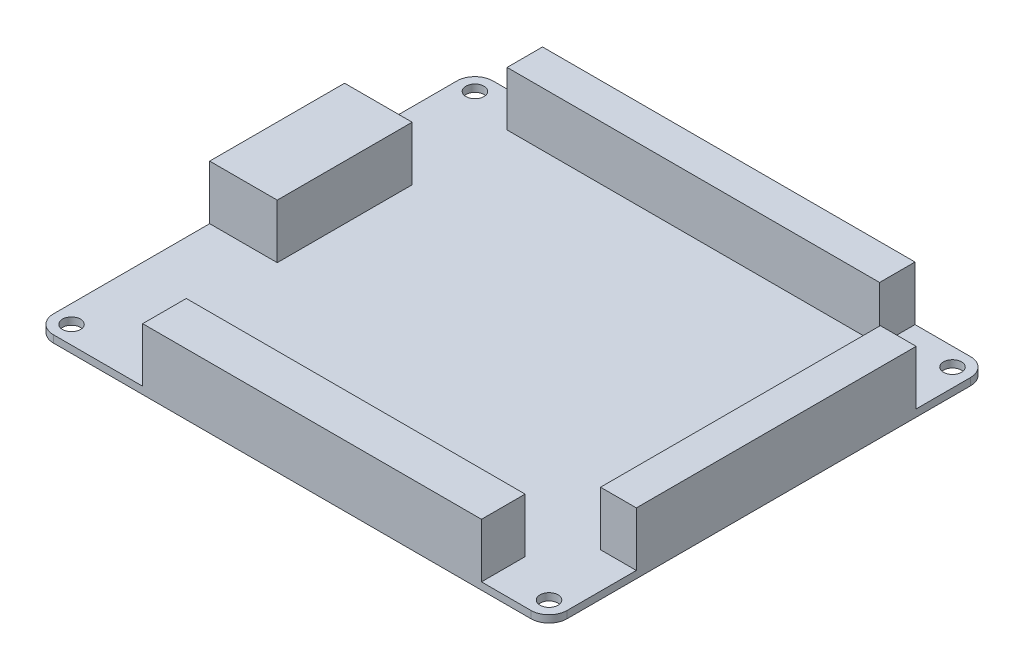
ISO-10303-21;
HEADER;
FILE_DESCRIPTION(('STEP AP214'),'2;1');
FILE_NAME('part.step','',(''),(''),'','','');
FILE_SCHEMA(('AUTOMOTIVE_DESIGN { 1 0 10303 214 1 1 1 1 }'));
ENDSEC;
DATA;
#1=APPLICATION_CONTEXT('core data for automotive mechanical design processes');
#2=APPLICATION_PROTOCOL_DEFINITION('international standard','automotive_design',2000,#1);
#3=PRODUCT_CONTEXT('',#1,'mechanical');
#4=PRODUCT('Part','Part','',(#3));
#5=PRODUCT_RELATED_PRODUCT_CATEGORY('part','',(#4));
#6=PRODUCT_DEFINITION_FORMATION('','',#4);
#7=PRODUCT_DEFINITION_CONTEXT('part definition',#1,'design');
#8=PRODUCT_DEFINITION('design','',#6,#7);
#9=PRODUCT_DEFINITION_SHAPE('','',#8);
#10=(LENGTH_UNIT() NAMED_UNIT(*) SI_UNIT(.MILLI.,.METRE.));
#11=(NAMED_UNIT(*) PLANE_ANGLE_UNIT() SI_UNIT($,.RADIAN.));
#12=(NAMED_UNIT(*) SI_UNIT($,.STERADIAN.) SOLID_ANGLE_UNIT());
#13=UNCERTAINTY_MEASURE_WITH_UNIT(LENGTH_MEASURE(1.E-05),#10,'distance_accuracy_value','');
#14=(GEOMETRIC_REPRESENTATION_CONTEXT(3) GLOBAL_UNCERTAINTY_ASSIGNED_CONTEXT((#13)) GLOBAL_UNIT_ASSIGNED_CONTEXT((#10,
#11,#12)) REPRESENTATION_CONTEXT('',''));
#15=CARTESIAN_POINT('',(0.,0.,0.));
#16=DIRECTION('',(0.,0.,1.));
#17=DIRECTION('',(1.,0.,0.));
#18=AXIS2_PLACEMENT_3D('',#15,#16,#17);
#19=CARTESIAN_POINT('',(0.,1.2,0.));
#20=DIRECTION('',(0.,1.,0.));
#21=DIRECTION('',(0.,0.,1.));
#22=AXIS2_PLACEMENT_3D('',#19,#20,#21);
#23=PLANE('',#22);
#24=CARTESIAN_POINT('',(39.65,1.2,33.5));
#25=DIRECTION('',(0.,1.,0.));
#26=DIRECTION('',(0.,0.,1.));
#27=AXIS2_PLACEMENT_3D('',#24,#25,#26);
#28=CIRCLE('',#27,1.5);
#29=CARTESIAN_POINT('',(39.65,1.2,35.));
#30=VERTEX_POINT('',#29);
#31=EDGE_CURVE('E323',#30,#30,#28,.T.);
#32=ORIENTED_EDGE('',*,*,#31,.F.);
#33=EDGE_LOOP('',(#32));
#34=FACE_BOUND('',#33,.T.);
#35=CARTESIAN_POINT('',(-39.65,1.2,33.5));
#36=DIRECTION('',(0.,1.,0.));
#37=DIRECTION('',(0.,0.,1.));
#38=AXIS2_PLACEMENT_3D('',#35,#36,#37);
#39=CIRCLE('',#38,1.5);
#40=CARTESIAN_POINT('',(-39.65,1.2,35.));
#41=VERTEX_POINT('',#40);
#42=EDGE_CURVE('E326',#41,#41,#39,.T.);
#43=ORIENTED_EDGE('',*,*,#42,.F.);
#44=EDGE_LOOP('',(#43));
#45=FACE_BOUND('',#44,.T.);
#46=CARTESIAN_POINT('',(-39.65,1.2,-33.5));
#47=DIRECTION('',(0.,1.,0.));
#48=DIRECTION('',(0.,0.,1.));
#49=AXIS2_PLACEMENT_3D('',#46,#47,#48);
#50=CIRCLE('',#49,1.5);
#51=CARTESIAN_POINT('',(-39.65,1.2,-32.));
#52=VERTEX_POINT('',#51);
#53=EDGE_CURVE('E330',#52,#52,#50,.T.);
#54=ORIENTED_EDGE('',*,*,#53,.F.);
#55=EDGE_LOOP('',(#54));
#56=FACE_BOUND('',#55,.T.);
#57=CARTESIAN_POINT('',(39.65,1.2,-33.5));
#58=DIRECTION('',(0.,1.,0.));
#59=DIRECTION('',(0.,0.,1.));
#60=AXIS2_PLACEMENT_3D('',#57,#58,#59);
#61=CIRCLE('',#60,1.5);
#62=CARTESIAN_POINT('',(39.65,1.2,-32.));
#63=VERTEX_POINT('',#62);
#64=EDGE_CURVE('E333',#63,#63,#61,.T.);
#65=ORIENTED_EDGE('',*,*,#64,.F.);
#66=EDGE_LOOP('',(#65));
#67=FACE_BOUND('',#66,.T.);
#68=DIRECTION('',(0.,0.,-1.));
#69=VECTOR('',#68,1.);
#70=CARTESIAN_POINT('',(-31.4294914173132,1.2,7.5566174845676));
#71=LINE('',#70,#69);
#72=CARTESIAN_POINT('',(-31.4294914173132,1.2,7.5566174845676));
#73=VERTEX_POINT('',#72);
#74=CARTESIAN_POINT('',(-31.4294914173132,1.2,-14.8489717856251));
#75=VERTEX_POINT('',#74);
#76=EDGE_CURVE('E207',#73,#75,#71,.T.);
#77=ORIENTED_EDGE('',*,*,#76,.F.);
#78=DIRECTION('',(1.,0.,0.));
#79=VECTOR('',#78,1.);
#80=CARTESIAN_POINT('',(-42.65,1.2,7.5566174845676));
#81=LINE('',#80,#79);
#82=CARTESIAN_POINT('',(-42.65,1.2,7.5566174845676));
#83=VERTEX_POINT('',#82);
#84=EDGE_CURVE('E217',#83,#73,#81,.T.);
#85=ORIENTED_EDGE('',*,*,#84,.F.);
#86=DIRECTION('',(0.,0.,-1.));
#87=VECTOR('',#86,1.);
#88=CARTESIAN_POINT('',(-42.65,1.2,0.));
#89=LINE('',#88,#87);
#90=CARTESIAN_POINT('',(-42.65,1.2,33.5));
#91=VERTEX_POINT('',#90);
#92=EDGE_CURVE('E341',#91,#83,#89,.T.);
#93=ORIENTED_EDGE('',*,*,#92,.F.);
#94=CARTESIAN_POINT('',(-39.65,1.2,33.5));
#95=DIRECTION('',(0.,1.,0.));
#96=DIRECTION('',(0.,0.,1.));
#97=AXIS2_PLACEMENT_3D('',#94,#95,#96);
#98=CIRCLE('',#97,3.);
#99=CARTESIAN_POINT('',(-39.65,1.2,36.5));
#100=VERTEX_POINT('',#99);
#101=EDGE_CURVE('E344',#100,#91,#98,.F.);
#102=ORIENTED_EDGE('',*,*,#101,.F.);
#103=DIRECTION('',(-1.,0.,0.));
#104=VECTOR('',#103,1.);
#105=CARTESIAN_POINT('',(0.,1.2,36.5));
#106=LINE('',#105,#104);
#107=CARTESIAN_POINT('',(-24.8332701548577,1.2,36.5));
#108=VERTEX_POINT('',#107);
#109=EDGE_CURVE('E347',#108,#100,#106,.T.);
#110=ORIENTED_EDGE('',*,*,#109,.F.);
#111=DIRECTION('',(0.,0.,1.));
#112=VECTOR('',#111,1.);
#113=CARTESIAN_POINT('',(-24.8332701548577,1.2,36.5));
#114=LINE('',#113,#112);
#115=CARTESIAN_POINT('',(-24.8332701548577,1.2,29.2535338291486));
#116=VERTEX_POINT('',#115);
#117=EDGE_CURVE('E285',#116,#108,#114,.T.);
#118=ORIENTED_EDGE('',*,*,#117,.F.);
#119=DIRECTION('',(-1.,0.,0.));
#120=VECTOR('',#119,1.);
#121=CARTESIAN_POINT('',(-24.8332701548577,1.2,29.2535338291486));
#122=LINE('',#121,#120);
#123=CARTESIAN_POINT('',(31.4318004054144,1.2,29.2535338291486));
#124=VERTEX_POINT('',#123);
#125=EDGE_CURVE('E297',#124,#116,#122,.T.);
#126=ORIENTED_EDGE('',*,*,#125,.F.);
#127=DIRECTION('',(0.,0.,-1.));
#128=VECTOR('',#127,1.);
#129=CARTESIAN_POINT('',(31.4318004054144,1.2,36.5));
#130=LINE('',#129,#128);
#131=CARTESIAN_POINT('',(31.4318004054144,1.2,36.5));
#132=VERTEX_POINT('',#131);
#133=EDGE_CURVE('E306',#132,#124,#130,.T.);
#134=ORIENTED_EDGE('',*,*,#133,.F.);
#135=CARTESIAN_POINT('',(39.65,1.2,36.5));
#136=VERTEX_POINT('',#135);
#137=EDGE_CURVE('E348',#136,#132,#106,.T.);
#138=ORIENTED_EDGE('',*,*,#137,.F.);
#139=CARTESIAN_POINT('',(39.65,1.2,33.5));
#140=DIRECTION('',(0.,1.,0.));
#141=DIRECTION('',(0.,0.,1.));
#142=AXIS2_PLACEMENT_3D('',#139,#140,#141);
#143=CIRCLE('',#142,3.);
#144=CARTESIAN_POINT('',(42.65,1.2,33.5));
#145=VERTEX_POINT('',#144);
#146=EDGE_CURVE('E351',#136,#145,#143,.T.);
#147=ORIENTED_EDGE('',*,*,#146,.T.);
#148=DIRECTION('',(0.,0.,-1.));
#149=VECTOR('',#148,1.);
#150=CARTESIAN_POINT('',(42.65,1.2,0.));
#151=LINE('',#150,#149);
#152=CARTESIAN_POINT('',(42.65,1.2,22.0023264793383));
#153=VERTEX_POINT('',#152);
#154=EDGE_CURVE('E354',#145,#153,#151,.T.);
#155=ORIENTED_EDGE('',*,*,#154,.T.);
#156=DIRECTION('',(1.,0.,0.));
#157=VECTOR('',#156,1.);
#158=CARTESIAN_POINT('',(42.65,1.2,22.0023264793383));
#159=LINE('',#158,#157);
#160=CARTESIAN_POINT('',(36.7030546103138,1.2,22.0023264793383));
#161=VERTEX_POINT('',#160);
#162=EDGE_CURVE('E277',#161,#153,#159,.T.);
#163=ORIENTED_EDGE('',*,*,#162,.F.);
#164=DIRECTION('',(0.,0.,1.));
#165=VECTOR('',#164,1.);
#166=CARTESIAN_POINT('',(36.7030546103138,1.2,22.0023264793383));
#167=LINE('',#166,#165);
#168=CARTESIAN_POINT('',(36.7030546103138,1.2,-24.4645359927915));
#169=VERTEX_POINT('',#168);
#170=EDGE_CURVE('E279',#169,#161,#167,.T.);
#171=ORIENTED_EDGE('',*,*,#170,.F.);
#172=DIRECTION('',(-1.,0.,0.));
#173=VECTOR('',#172,1.);
#174=CARTESIAN_POINT('',(42.65,1.2,-24.4645359927915));
#175=LINE('',#174,#173);
#176=CARTESIAN_POINT('',(42.65,1.2,-24.4645359927915));
#177=VERTEX_POINT('',#176);
#178=EDGE_CURVE('E283',#177,#169,#175,.T.);
#179=ORIENTED_EDGE('',*,*,#178,.F.);
#180=CARTESIAN_POINT('',(42.65,1.2,-33.5));
#181=VERTEX_POINT('',#180);
#182=EDGE_CURVE('E353',#177,#181,#151,.T.);
#183=ORIENTED_EDGE('',*,*,#182,.T.);
#184=CARTESIAN_POINT('',(39.65,1.2,-33.5));
#185=DIRECTION('',(0.,1.,0.));
#186=DIRECTION('',(0.,0.,1.));
#187=AXIS2_PLACEMENT_3D('',#184,#185,#186);
#188=CIRCLE('',#187,3.);
#189=CARTESIAN_POINT('',(39.65,1.2,-36.5));
#190=VERTEX_POINT('',#189);
#191=EDGE_CURVE('E357',#181,#190,#188,.T.);
#192=ORIENTED_EDGE('',*,*,#191,.T.);
#193=DIRECTION('',(-1.,0.,0.));
#194=VECTOR('',#193,1.);
#195=CARTESIAN_POINT('',(0.,1.2,-36.5));
#196=LINE('',#195,#194);
#197=CARTESIAN_POINT('',(30.428301479688,1.2,-36.5));
#198=VERTEX_POINT('',#197);
#199=EDGE_CURVE('E337',#190,#198,#196,.T.);
#200=ORIENTED_EDGE('',*,*,#199,.T.);
#201=DIRECTION('',(0.,0.,-1.));
#202=VECTOR('',#201,1.);
#203=CARTESIAN_POINT('',(30.428301479688,1.2,-36.5));
#204=LINE('',#203,#202);
#205=CARTESIAN_POINT('',(30.428301479688,1.2,-30.6142275398429));
#206=VERTEX_POINT('',#205);
#207=EDGE_CURVE('E256',#206,#198,#204,.T.);
#208=ORIENTED_EDGE('',*,*,#207,.F.);
#209=DIRECTION('',(1.,0.,0.));
#210=VECTOR('',#209,1.);
#211=CARTESIAN_POINT('',(30.428301479688,1.2,-30.6142275398429));
#212=LINE('',#211,#210);
#213=CARTESIAN_POINT('',(-31.4294914173132,1.2,-30.6142275398429));
#214=VERTEX_POINT('',#213);
#215=EDGE_CURVE('E66',#214,#206,#212,.T.);
#216=ORIENTED_EDGE('',*,*,#215,.F.);
#217=DIRECTION('',(0.,0.,1.));
#218=VECTOR('',#217,1.);
#219=CARTESIAN_POINT('',(-31.4294914173132,1.2,-36.5));
#220=LINE('',#219,#218);
#221=CARTESIAN_POINT('',(-31.4294914173132,1.2,-36.5));
#222=VERTEX_POINT('',#221);
#223=EDGE_CURVE('E253',#222,#214,#220,.T.);
#224=ORIENTED_EDGE('',*,*,#223,.F.);
#225=CARTESIAN_POINT('',(-39.65,1.2,-36.5));
#226=VERTEX_POINT('',#225);
#227=EDGE_CURVE('E336',#222,#226,#196,.T.);
#228=ORIENTED_EDGE('',*,*,#227,.T.);
#229=CARTESIAN_POINT('',(-39.65,1.2,-33.5));
#230=DIRECTION('',(0.,1.,0.));
#231=DIRECTION('',(0.,0.,1.));
#232=AXIS2_PLACEMENT_3D('',#229,#230,#231);
#233=CIRCLE('',#232,3.);
#234=CARTESIAN_POINT('',(-42.65,1.2,-33.5));
#235=VERTEX_POINT('',#234);
#236=EDGE_CURVE('E339',#226,#235,#233,.T.);
#237=ORIENTED_EDGE('',*,*,#236,.T.);
#238=CARTESIAN_POINT('',(-42.65,1.2,-14.8489717856251));
#239=VERTEX_POINT('',#238);
#240=EDGE_CURVE('E226',#239,#235,#89,.T.);
#241=ORIENTED_EDGE('',*,*,#240,.F.);
#242=DIRECTION('',(-1.,0.,0.));
#243=VECTOR('',#242,1.);
#244=CARTESIAN_POINT('',(-42.65,1.2,-14.8489717856251));
#245=LINE('',#244,#243);
#246=EDGE_CURVE('E218',#75,#239,#245,.T.);
#247=ORIENTED_EDGE('',*,*,#246,.F.);
#248=EDGE_LOOP('',(#77,#85,#93,#102,#110,#118,#126,#134,#138,#147,#155,#163,#171,#179,#183,#192,
#200,#208,#216,#224,#228,#237,#241,#247));
#249=FACE_BOUND('',#248,.T.);
#250=ADVANCED_FACE('F43',(#34,#45,#56,#67,#249),#23,.T.);
#251=CARTESIAN_POINT('',(0.,1.2,-36.5));
#252=DIRECTION('',(0.,0.,1.));
#253=DIRECTION('',(1.,0.,0.));
#254=AXIS2_PLACEMENT_3D('',#251,#252,#253);
#255=PLANE('',#254);
#256=DIRECTION('',(-1.,0.,0.));
#257=VECTOR('',#256,1.);
#258=CARTESIAN_POINT('',(0.,0.,-36.5));
#259=LINE('',#258,#257);
#260=CARTESIAN_POINT('',(39.65,0.,-36.5));
#261=VERTEX_POINT('',#260);
#262=CARTESIAN_POINT('',(-39.65,0.,-36.5));
#263=VERTEX_POINT('',#262);
#264=EDGE_CURVE('E371',#261,#263,#259,.T.);
#265=ORIENTED_EDGE('',*,*,#264,.T.);
#266=DIRECTION('',(0.,-1.,0.));
#267=VECTOR('',#266,1.);
#268=CARTESIAN_POINT('',(-39.65,1.2,-36.5));
#269=LINE('',#268,#267);
#270=EDGE_CURVE('E11',#226,#263,#269,.T.);
#271=ORIENTED_EDGE('',*,*,#270,.F.);
#272=ORIENTED_EDGE('',*,*,#227,.F.);
#273=DIRECTION('',(0.,-1.,0.));
#274=VECTOR('',#273,1.);
#275=CARTESIAN_POINT('',(-31.4294914173132,10.2,-36.5));
#276=LINE('',#275,#274);
#277=CARTESIAN_POINT('',(-31.4294914173132,10.2,-36.5));
#278=VERTEX_POINT('',#277);
#279=EDGE_CURVE('E242',#278,#222,#276,.T.);
#280=ORIENTED_EDGE('',*,*,#279,.F.);
#281=DIRECTION('',(-1.,0.,0.));
#282=VECTOR('',#281,1.);
#283=CARTESIAN_POINT('',(30.428301479688,10.2,-36.5));
#284=LINE('',#283,#282);
#285=CARTESIAN_POINT('',(30.428301479688,10.2,-36.5));
#286=VERTEX_POINT('',#285);
#287=EDGE_CURVE('E263',#286,#278,#284,.T.);
#288=ORIENTED_EDGE('',*,*,#287,.F.);
#289=DIRECTION('',(0.,-1.,0.));
#290=VECTOR('',#289,1.);
#291=CARTESIAN_POINT('',(30.428301479688,10.2,-36.5));
#292=LINE('',#291,#290);
#293=EDGE_CURVE('E235',#286,#198,#292,.T.);
#294=ORIENTED_EDGE('',*,*,#293,.T.);
#295=ORIENTED_EDGE('',*,*,#199,.F.);
#296=DIRECTION('',(0.,-1.,0.));
#297=VECTOR('',#296,1.);
#298=CARTESIAN_POINT('',(39.65,1.2,-36.5));
#299=LINE('',#298,#297);
#300=EDGE_CURVE('E359',#190,#261,#299,.T.);
#301=ORIENTED_EDGE('',*,*,#300,.T.);
#302=EDGE_LOOP('',(#265,#271,#272,#280,#288,#294,#295,#301));
#303=FACE_BOUND('',#302,.T.);
#304=ADVANCED_FACE('F438',(#303),#255,.F.);
#305=CARTESIAN_POINT('',(-39.65,1.2,-33.5));
#306=DIRECTION('',(0.,-1.,0.));
#307=DIRECTION('',(0.,0.,-1.));
#308=AXIS2_PLACEMENT_3D('',#305,#306,#307);
#309=CYLINDRICAL_SURFACE('',#308,3.);
#310=CARTESIAN_POINT('',(-39.65,0.,-33.5));
#311=DIRECTION('',(0.,1.,0.));
#312=DIRECTION('',(0.,0.,1.));
#313=AXIS2_PLACEMENT_3D('',#310,#311,#312);
#314=CIRCLE('',#313,3.);
#315=CARTESIAN_POINT('',(-42.65,0.,-33.5));
#316=VERTEX_POINT('',#315);
#317=EDGE_CURVE('E374',#263,#316,#314,.T.);
#318=ORIENTED_EDGE('',*,*,#317,.T.);
#319=DIRECTION('',(0.,-1.,0.));
#320=VECTOR('',#319,1.);
#321=CARTESIAN_POINT('',(-42.65,1.2,-33.5));
#322=LINE('',#321,#320);
#323=EDGE_CURVE('E51',#235,#316,#322,.T.);
#324=ORIENTED_EDGE('',*,*,#323,.F.);
#325=ORIENTED_EDGE('',*,*,#236,.F.);
#326=ORIENTED_EDGE('',*,*,#270,.T.);
#327=EDGE_LOOP('',(#318,#324,#325,#326));
#328=FACE_BOUND('',#327,.T.);
#329=ADVANCED_FACE('F409',(#328),#309,.T.);
#330=CARTESIAN_POINT('',(-42.65,1.2,0.));
#331=DIRECTION('',(-1.,0.,0.));
#332=DIRECTION('',(0.,0.,1.));
#333=AXIS2_PLACEMENT_3D('',#330,#331,#332);
#334=PLANE('',#333);
#335=DIRECTION('',(0.,0.,-1.));
#336=VECTOR('',#335,1.);
#337=CARTESIAN_POINT('',(-42.65,0.,0.));
#338=LINE('',#337,#336);
#339=CARTESIAN_POINT('',(-42.65,0.,33.5));
#340=VERTEX_POINT('',#339);
#341=EDGE_CURVE('E377',#340,#316,#338,.T.);
#342=ORIENTED_EDGE('',*,*,#341,.F.);
#343=DIRECTION('',(0.,-1.,0.));
#344=VECTOR('',#343,1.);
#345=CARTESIAN_POINT('',(-42.65,1.2,33.5));
#346=LINE('',#345,#344);
#347=EDGE_CURVE('E403',#91,#340,#346,.T.);
#348=ORIENTED_EDGE('',*,*,#347,.F.);
#349=ORIENTED_EDGE('',*,*,#92,.T.);
#350=DIRECTION('',(0.,-1.,0.));
#351=VECTOR('',#350,1.);
#352=CARTESIAN_POINT('',(-42.65,10.2,7.5566174845676));
#353=LINE('',#352,#351);
#354=CARTESIAN_POINT('',(-42.65,10.2,7.5566174845676));
#355=VERTEX_POINT('',#354);
#356=EDGE_CURVE('E425',#355,#83,#353,.T.);
#357=ORIENTED_EDGE('',*,*,#356,.F.);
#358=DIRECTION('',(0.,0.,1.));
#359=VECTOR('',#358,1.);
#360=CARTESIAN_POINT('',(-42.65,10.2,7.5566174845676));
#361=LINE('',#360,#359);
#362=CARTESIAN_POINT('',(-42.65,10.2,-14.8489717856251));
#363=VERTEX_POINT('',#362);
#364=EDGE_CURVE('E227',#363,#355,#361,.T.);
#365=ORIENTED_EDGE('',*,*,#364,.F.);
#366=DIRECTION('',(0.,-1.,0.));
#367=VECTOR('',#366,1.);
#368=CARTESIAN_POINT('',(-42.65,10.2,-14.8489717856251));
#369=LINE('',#368,#367);
#370=EDGE_CURVE('E58',#363,#239,#369,.T.);
#371=ORIENTED_EDGE('',*,*,#370,.T.);
#372=ORIENTED_EDGE('',*,*,#240,.T.);
#373=ORIENTED_EDGE('',*,*,#323,.T.);
#374=EDGE_LOOP('',(#342,#348,#349,#357,#365,#371,#372,#373));
#375=FACE_BOUND('',#374,.T.);
#376=ADVANCED_FACE('F406',(#375),#334,.T.);
#377=CARTESIAN_POINT('',(-39.65,1.2,33.5));
#378=DIRECTION('',(0.,-1.,0.));
#379=DIRECTION('',(0.,0.,-1.));
#380=AXIS2_PLACEMENT_3D('',#377,#378,#379);
#381=CYLINDRICAL_SURFACE('',#380,3.);
#382=CARTESIAN_POINT('',(-39.65,0.,33.5));
#383=DIRECTION('',(0.,1.,0.));
#384=DIRECTION('',(0.,0.,1.));
#385=AXIS2_PLACEMENT_3D('',#382,#383,#384);
#386=CIRCLE('',#385,3.);
#387=CARTESIAN_POINT('',(-39.65,0.,36.5));
#388=VERTEX_POINT('',#387);
#389=EDGE_CURVE('E380',#388,#340,#386,.F.);
#390=ORIENTED_EDGE('',*,*,#389,.F.);
#391=DIRECTION('',(0.,-1.,0.));
#392=VECTOR('',#391,1.);
#393=CARTESIAN_POINT('',(-39.65,1.2,36.5));
#394=LINE('',#393,#392);
#395=EDGE_CURVE('E401',#100,#388,#394,.T.);
#396=ORIENTED_EDGE('',*,*,#395,.F.);
#397=ORIENTED_EDGE('',*,*,#101,.T.);
#398=ORIENTED_EDGE('',*,*,#347,.T.);
#399=EDGE_LOOP('',(#390,#396,#397,#398));
#400=FACE_BOUND('',#399,.T.);
#401=ADVANCED_FACE('F419',(#400),#381,.T.);
#402=CARTESIAN_POINT('',(0.,1.2,36.5));
#403=DIRECTION('',(0.,0.,1.));
#404=DIRECTION('',(1.,0.,0.));
#405=AXIS2_PLACEMENT_3D('',#402,#403,#404);
#406=PLANE('',#405);
#407=DIRECTION('',(-1.,0.,0.));
#408=VECTOR('',#407,1.);
#409=CARTESIAN_POINT('',(0.,0.,36.5));
#410=LINE('',#409,#408);
#411=CARTESIAN_POINT('',(39.65,0.,36.5));
#412=VERTEX_POINT('',#411);
#413=EDGE_CURVE('E383',#412,#388,#410,.T.);
#414=ORIENTED_EDGE('',*,*,#413,.F.);
#415=DIRECTION('',(0.,-1.,0.));
#416=VECTOR('',#415,1.);
#417=CARTESIAN_POINT('',(39.65,1.2,36.5));
#418=LINE('',#417,#416);
#419=EDGE_CURVE('E399',#136,#412,#418,.T.);
#420=ORIENTED_EDGE('',*,*,#419,.F.);
#421=ORIENTED_EDGE('',*,*,#137,.T.);
#422=DIRECTION('',(0.,-1.,0.));
#423=VECTOR('',#422,1.);
#424=CARTESIAN_POINT('',(31.4318004054144,10.2,36.5));
#425=LINE('',#424,#423);
#426=CARTESIAN_POINT('',(31.4318004054144,10.2,36.5));
#427=VERTEX_POINT('',#426);
#428=EDGE_CURVE('E316',#427,#132,#425,.T.);
#429=ORIENTED_EDGE('',*,*,#428,.F.);
#430=DIRECTION('',(1.,0.,0.));
#431=VECTOR('',#430,1.);
#432=CARTESIAN_POINT('',(-24.8332701548577,10.2,36.5));
#433=LINE('',#432,#431);
#434=CARTESIAN_POINT('',(-24.8332701548577,10.2,36.5));
#435=VERTEX_POINT('',#434);
#436=EDGE_CURVE('E296',#435,#427,#433,.T.);
#437=ORIENTED_EDGE('',*,*,#436,.F.);
#438=DIRECTION('',(0.,-1.,0.));
#439=VECTOR('',#438,1.);
#440=CARTESIAN_POINT('',(-24.8332701548577,10.2,36.5));
#441=LINE('',#440,#439);
#442=EDGE_CURVE('E319',#435,#108,#441,.T.);
#443=ORIENTED_EDGE('',*,*,#442,.T.);
#444=ORIENTED_EDGE('',*,*,#109,.T.);
#445=ORIENTED_EDGE('',*,*,#395,.T.);
#446=EDGE_LOOP('',(#414,#420,#421,#429,#437,#443,#444,#445));
#447=FACE_BOUND('',#446,.T.);
#448=ADVANCED_FACE('F467',(#447),#406,.T.);
#449=CARTESIAN_POINT('',(39.65,1.2,33.5));
#450=DIRECTION('',(0.,-1.,0.));
#451=DIRECTION('',(0.,0.,-1.));
#452=AXIS2_PLACEMENT_3D('',#449,#450,#451);
#453=CYLINDRICAL_SURFACE('',#452,3.);
#454=CARTESIAN_POINT('',(39.65,0.,33.5));
#455=DIRECTION('',(0.,1.,0.));
#456=DIRECTION('',(0.,0.,1.));
#457=AXIS2_PLACEMENT_3D('',#454,#455,#456);
#458=CIRCLE('',#457,3.);
#459=CARTESIAN_POINT('',(42.65,0.,33.5));
#460=VERTEX_POINT('',#459);
#461=EDGE_CURVE('E386',#412,#460,#458,.T.);
#462=ORIENTED_EDGE('',*,*,#461,.T.);
#463=DIRECTION('',(0.,-1.,0.));
#464=VECTOR('',#463,1.);
#465=CARTESIAN_POINT('',(42.65,1.2,33.5));
#466=LINE('',#465,#464);
#467=EDGE_CURVE('E396',#145,#460,#466,.T.);
#468=ORIENTED_EDGE('',*,*,#467,.F.);
#469=ORIENTED_EDGE('',*,*,#146,.F.);
#470=ORIENTED_EDGE('',*,*,#419,.T.);
#471=EDGE_LOOP('',(#462,#468,#469,#470));
#472=FACE_BOUND('',#471,.T.);
#473=ADVANCED_FACE('F463',(#472),#453,.T.);
#474=CARTESIAN_POINT('',(42.65,1.2,0.));
#475=DIRECTION('',(-1.,0.,0.));
#476=DIRECTION('',(0.,0.,1.));
#477=AXIS2_PLACEMENT_3D('',#474,#475,#476);
#478=PLANE('',#477);
#479=DIRECTION('',(0.,0.,-1.));
#480=VECTOR('',#479,1.);
#481=CARTESIAN_POINT('',(42.65,0.,0.));
#482=LINE('',#481,#480);
#483=CARTESIAN_POINT('',(42.65,0.,-33.5));
#484=VERTEX_POINT('',#483);
#485=EDGE_CURVE('E388',#460,#484,#482,.T.);
#486=ORIENTED_EDGE('',*,*,#485,.T.);
#487=DIRECTION('',(0.,-1.,0.));
#488=VECTOR('',#487,1.);
#489=CARTESIAN_POINT('',(42.65,1.2,-33.5));
#490=LINE('',#489,#488);
#491=EDGE_CURVE('E393',#181,#484,#490,.T.);
#492=ORIENTED_EDGE('',*,*,#491,.F.);
#493=ORIENTED_EDGE('',*,*,#182,.F.);
#494=DIRECTION('',(0.,-1.,0.));
#495=VECTOR('',#494,1.);
#496=CARTESIAN_POINT('',(42.65,10.2,-24.4645359927915));
#497=LINE('',#496,#495);
#498=CARTESIAN_POINT('',(42.65,10.2,-24.4645359927915));
#499=VERTEX_POINT('',#498);
#500=EDGE_CURVE('E259',#499,#177,#497,.T.);
#501=ORIENTED_EDGE('',*,*,#500,.F.);
#502=DIRECTION('',(0.,0.,-1.));
#503=VECTOR('',#502,1.);
#504=CARTESIAN_POINT('',(42.65,10.2,22.0023264793383));
#505=LINE('',#504,#503);
#506=CARTESIAN_POINT('',(42.65,10.2,22.0023264793383));
#507=VERTEX_POINT('',#506);
#508=EDGE_CURVE('E280',#507,#499,#505,.T.);
#509=ORIENTED_EDGE('',*,*,#508,.F.);
#510=DIRECTION('',(0.,-1.,0.));
#511=VECTOR('',#510,1.);
#512=CARTESIAN_POINT('',(42.65,10.2,22.0023264793383));
#513=LINE('',#512,#511);
#514=EDGE_CURVE('E273',#507,#153,#513,.T.);
#515=ORIENTED_EDGE('',*,*,#514,.T.);
#516=ORIENTED_EDGE('',*,*,#154,.F.);
#517=ORIENTED_EDGE('',*,*,#467,.T.);
#518=EDGE_LOOP('',(#486,#492,#493,#501,#509,#515,#516,#517));
#519=FACE_BOUND('',#518,.T.);
#520=ADVANCED_FACE('F459',(#519),#478,.F.);
#521=CARTESIAN_POINT('',(39.65,1.2,-33.5));
#522=DIRECTION('',(0.,-1.,0.));
#523=DIRECTION('',(0.,0.,-1.));
#524=AXIS2_PLACEMENT_3D('',#521,#522,#523);
#525=CYLINDRICAL_SURFACE('',#524,1.5);
#526=ORIENTED_EDGE('',*,*,#64,.T.);
#527=EDGE_LOOP('',(#526));
#528=FACE_BOUND('',#527,.T.);
#529=CARTESIAN_POINT('',(39.65,0.,-33.5));
#530=DIRECTION('',(0.,1.,0.));
#531=DIRECTION('',(0.,0.,1.));
#532=AXIS2_PLACEMENT_3D('',#529,#530,#531);
#533=CIRCLE('',#532,1.5);
#534=CARTESIAN_POINT('',(39.65,0.,-32.));
#535=VERTEX_POINT('',#534);
#536=EDGE_CURVE('E368',#535,#535,#533,.T.);
#537=ORIENTED_EDGE('',*,*,#536,.F.);
#538=EDGE_LOOP('',(#537));
#539=FACE_BOUND('',#538,.T.);
#540=ADVANCED_FACE('F462',(#528,#539),#525,.F.);
#541=CARTESIAN_POINT('',(-39.65,1.2,-33.5));
#542=DIRECTION('',(0.,-1.,0.));
#543=DIRECTION('',(0.,0.,-1.));
#544=AXIS2_PLACEMENT_3D('',#541,#542,#543);
#545=CYLINDRICAL_SURFACE('',#544,1.5);
#546=ORIENTED_EDGE('',*,*,#53,.T.);
#547=EDGE_LOOP('',(#546));
#548=FACE_BOUND('',#547,.T.);
#549=CARTESIAN_POINT('',(-39.65,0.,-33.5));
#550=DIRECTION('',(0.,1.,0.));
#551=DIRECTION('',(0.,0.,1.));
#552=AXIS2_PLACEMENT_3D('',#549,#550,#551);
#553=CIRCLE('',#552,1.5);
#554=CARTESIAN_POINT('',(-39.65,0.,-32.));
#555=VERTEX_POINT('',#554);
#556=EDGE_CURVE('E365',#555,#555,#553,.T.);
#557=ORIENTED_EDGE('',*,*,#556,.F.);
#558=EDGE_LOOP('',(#557));
#559=FACE_BOUND('',#558,.T.);
#560=ADVANCED_FACE('F480',(#548,#559),#545,.F.);
#561=CARTESIAN_POINT('',(-39.65,1.2,33.5));
#562=DIRECTION('',(0.,-1.,0.));
#563=DIRECTION('',(0.,0.,-1.));
#564=AXIS2_PLACEMENT_3D('',#561,#562,#563);
#565=CYLINDRICAL_SURFACE('',#564,1.5);
#566=ORIENTED_EDGE('',*,*,#42,.T.);
#567=EDGE_LOOP('',(#566));
#568=FACE_BOUND('',#567,.T.);
#569=CARTESIAN_POINT('',(-39.65,0.,33.5));
#570=DIRECTION('',(0.,1.,0.));
#571=DIRECTION('',(0.,0.,1.));
#572=AXIS2_PLACEMENT_3D('',#569,#570,#571);
#573=CIRCLE('',#572,1.5);
#574=CARTESIAN_POINT('',(-39.65,0.,35.));
#575=VERTEX_POINT('',#574);
#576=EDGE_CURVE('E362',#575,#575,#573,.T.);
#577=ORIENTED_EDGE('',*,*,#576,.F.);
#578=EDGE_LOOP('',(#577));
#579=FACE_BOUND('',#578,.T.);
#580=ADVANCED_FACE('F483',(#568,#579),#565,.F.);
#581=CARTESIAN_POINT('',(39.65,1.2,33.5));
#582=DIRECTION('',(0.,-1.,0.));
#583=DIRECTION('',(0.,0.,-1.));
#584=AXIS2_PLACEMENT_3D('',#581,#582,#583);
#585=CYLINDRICAL_SURFACE('',#584,1.5);
#586=ORIENTED_EDGE('',*,*,#31,.T.);
#587=EDGE_LOOP('',(#586));
#588=FACE_BOUND('',#587,.T.);
#589=CARTESIAN_POINT('',(39.65,0.,33.5));
#590=DIRECTION('',(0.,1.,0.));
#591=DIRECTION('',(0.,0.,1.));
#592=AXIS2_PLACEMENT_3D('',#589,#590,#591);
#593=CIRCLE('',#592,1.5);
#594=CARTESIAN_POINT('',(39.65,0.,35.));
#595=VERTEX_POINT('',#594);
#596=EDGE_CURVE('E322',#595,#595,#593,.T.);
#597=ORIENTED_EDGE('',*,*,#596,.F.);
#598=EDGE_LOOP('',(#597));
#599=FACE_BOUND('',#598,.T.);
#600=ADVANCED_FACE('F45',(#588,#599),#585,.F.);
#601=CARTESIAN_POINT('',(39.65,1.2,-33.5));
#602=DIRECTION('',(0.,-1.,0.));
#603=DIRECTION('',(0.,0.,-1.));
#604=AXIS2_PLACEMENT_3D('',#601,#602,#603);
#605=CYLINDRICAL_SURFACE('',#604,3.);
#606=CARTESIAN_POINT('',(39.65,0.,-33.5));
#607=DIRECTION('',(0.,1.,0.));
#608=DIRECTION('',(0.,0.,1.));
#609=AXIS2_PLACEMENT_3D('',#606,#607,#608);
#610=CIRCLE('',#609,3.);
#611=EDGE_CURVE('E327',#484,#261,#610,.T.);
#612=ORIENTED_EDGE('',*,*,#611,.T.);
#613=ORIENTED_EDGE('',*,*,#300,.F.);
#614=ORIENTED_EDGE('',*,*,#191,.F.);
#615=ORIENTED_EDGE('',*,*,#491,.T.);
#616=EDGE_LOOP('',(#612,#613,#614,#615));
#617=FACE_BOUND('',#616,.T.);
#618=ADVANCED_FACE('F454',(#617),#605,.T.);
#619=CARTESIAN_POINT('',(0.,0.,0.));
#620=DIRECTION('',(0.,1.,0.));
#621=DIRECTION('',(0.,0.,1.));
#622=AXIS2_PLACEMENT_3D('',#619,#620,#621);
#623=PLANE('',#622);
#624=ORIENTED_EDGE('',*,*,#596,.T.);
#625=EDGE_LOOP('',(#624));
#626=FACE_BOUND('',#625,.T.);
#627=ORIENTED_EDGE('',*,*,#576,.T.);
#628=EDGE_LOOP('',(#627));
#629=FACE_BOUND('',#628,.T.);
#630=ORIENTED_EDGE('',*,*,#556,.T.);
#631=EDGE_LOOP('',(#630));
#632=FACE_BOUND('',#631,.T.);
#633=ORIENTED_EDGE('',*,*,#536,.T.);
#634=EDGE_LOOP('',(#633));
#635=FACE_BOUND('',#634,.T.);
#636=ORIENTED_EDGE('',*,*,#264,.F.);
#637=ORIENTED_EDGE('',*,*,#611,.F.);
#638=ORIENTED_EDGE('',*,*,#485,.F.);
#639=ORIENTED_EDGE('',*,*,#461,.F.);
#640=ORIENTED_EDGE('',*,*,#413,.T.);
#641=ORIENTED_EDGE('',*,*,#389,.T.);
#642=ORIENTED_EDGE('',*,*,#341,.T.);
#643=ORIENTED_EDGE('',*,*,#317,.F.);
#644=EDGE_LOOP('',(#636,#637,#638,#639,#640,#641,#642,#643));
#645=FACE_BOUND('',#644,.T.);
#646=ADVANCED_FACE('F413',(#626,#629,#632,#635,#645),#623,.F.);
#647=CARTESIAN_POINT('',(-24.8332701548577,10.2,36.5));
#648=DIRECTION('',(1.,0.,0.));
#649=DIRECTION('',(0.,0.,-1.));
#650=AXIS2_PLACEMENT_3D('',#647,#648,#649);
#651=PLANE('',#650);
#652=ORIENTED_EDGE('',*,*,#117,.T.);
#653=ORIENTED_EDGE('',*,*,#442,.F.);
#654=DIRECTION('',(0.,0.,1.));
#655=VECTOR('',#654,1.);
#656=CARTESIAN_POINT('',(-24.8332701548577,10.2,36.5));
#657=LINE('',#656,#655);
#658=CARTESIAN_POINT('',(-24.8332701548577,10.2,29.2535338291486));
#659=VERTEX_POINT('',#658);
#660=EDGE_CURVE('E293',#659,#435,#657,.T.);
#661=ORIENTED_EDGE('',*,*,#660,.F.);
#662=DIRECTION('',(0.,-1.,0.));
#663=VECTOR('',#662,1.);
#664=CARTESIAN_POINT('',(-24.8332701548577,10.2,29.2535338291486));
#665=LINE('',#664,#663);
#666=EDGE_CURVE('E303',#659,#116,#665,.T.);
#667=ORIENTED_EDGE('',*,*,#666,.T.);
#668=EDGE_LOOP('',(#652,#653,#661,#667));
#669=FACE_BOUND('',#668,.T.);
#670=ADVANCED_FACE('F450',(#669),#651,.F.);
#671=CARTESIAN_POINT('',(31.4318004054144,10.2,36.5));
#672=DIRECTION('',(-1.,0.,0.));
#673=DIRECTION('',(0.,0.,1.));
#674=AXIS2_PLACEMENT_3D('',#671,#672,#673);
#675=PLANE('',#674);
#676=ORIENTED_EDGE('',*,*,#133,.T.);
#677=DIRECTION('',(0.,-1.,0.));
#678=VECTOR('',#677,1.);
#679=CARTESIAN_POINT('',(31.4318004054144,10.2,29.2535338291486));
#680=LINE('',#679,#678);
#681=CARTESIAN_POINT('',(31.4318004054144,10.2,29.2535338291486));
#682=VERTEX_POINT('',#681);
#683=EDGE_CURVE('E313',#682,#124,#680,.T.);
#684=ORIENTED_EDGE('',*,*,#683,.F.);
#685=DIRECTION('',(0.,0.,-1.));
#686=VECTOR('',#685,1.);
#687=CARTESIAN_POINT('',(31.4318004054144,10.2,36.5));
#688=LINE('',#687,#686);
#689=EDGE_CURVE('E299',#427,#682,#688,.T.);
#690=ORIENTED_EDGE('',*,*,#689,.F.);
#691=ORIENTED_EDGE('',*,*,#428,.T.);
#692=EDGE_LOOP('',(#676,#684,#690,#691));
#693=FACE_BOUND('',#692,.T.);
#694=ADVANCED_FACE('F523',(#693),#675,.F.);
#695=CARTESIAN_POINT('',(-24.8332701548577,10.2,29.2535338291486));
#696=DIRECTION('',(0.,0.,1.));
#697=DIRECTION('',(1.,0.,0.));
#698=AXIS2_PLACEMENT_3D('',#695,#696,#697);
#699=PLANE('',#698);
#700=ORIENTED_EDGE('',*,*,#125,.T.);
#701=ORIENTED_EDGE('',*,*,#666,.F.);
#702=DIRECTION('',(-1.,0.,0.));
#703=VECTOR('',#702,1.);
#704=CARTESIAN_POINT('',(-24.8332701548577,10.2,29.2535338291486));
#705=LINE('',#704,#703);
#706=EDGE_CURVE('E301',#682,#659,#705,.T.);
#707=ORIENTED_EDGE('',*,*,#706,.F.);
#708=ORIENTED_EDGE('',*,*,#683,.T.);
#709=EDGE_LOOP('',(#700,#701,#707,#708));
#710=FACE_BOUND('',#709,.T.);
#711=ADVANCED_FACE('F531',(#710),#699,.F.);
#712=CARTESIAN_POINT('',(0.,10.2,0.));
#713=DIRECTION('',(0.,-1.,0.));
#714=DIRECTION('',(0.,0.,-1.));
#715=AXIS2_PLACEMENT_3D('',#712,#713,#714);
#716=PLANE('',#715);
#717=ORIENTED_EDGE('',*,*,#660,.T.);
#718=ORIENTED_EDGE('',*,*,#436,.T.);
#719=ORIENTED_EDGE('',*,*,#689,.T.);
#720=ORIENTED_EDGE('',*,*,#706,.T.);
#721=EDGE_LOOP('',(#717,#718,#719,#720));
#722=FACE_BOUND('',#721,.T.);
#723=ADVANCED_FACE('F538',(#722),#716,.F.);
#724=CARTESIAN_POINT('',(42.65,10.2,-24.4645359927915));
#725=DIRECTION('',(0.,0.,1.));
#726=DIRECTION('',(1.,0.,0.));
#727=AXIS2_PLACEMENT_3D('',#724,#725,#726);
#728=PLANE('',#727);
#729=ORIENTED_EDGE('',*,*,#178,.T.);
#730=DIRECTION('',(0.,-1.,0.));
#731=VECTOR('',#730,1.);
#732=CARTESIAN_POINT('',(36.7030546103138,10.2,-24.4645359927915));
#733=LINE('',#732,#731);
#734=CARTESIAN_POINT('',(36.7030546103138,10.2,-24.4645359927915));
#735=VERTEX_POINT('',#734);
#736=EDGE_CURVE('E268',#735,#169,#733,.T.);
#737=ORIENTED_EDGE('',*,*,#736,.F.);
#738=DIRECTION('',(-1.,0.,0.));
#739=VECTOR('',#738,1.);
#740=CARTESIAN_POINT('',(42.65,10.2,-24.4645359927915));
#741=LINE('',#740,#739);
#742=EDGE_CURVE('E289',#499,#735,#741,.T.);
#743=ORIENTED_EDGE('',*,*,#742,.F.);
#744=ORIENTED_EDGE('',*,*,#500,.T.);
#745=EDGE_LOOP('',(#729,#737,#743,#744));
#746=FACE_BOUND('',#745,.T.);
#747=ADVANCED_FACE('F546',(#746),#728,.F.);
#748=CARTESIAN_POINT('',(36.7030546103138,10.2,22.0023264793383));
#749=DIRECTION('',(1.,0.,0.));
#750=DIRECTION('',(0.,0.,-1.));
#751=AXIS2_PLACEMENT_3D('',#748,#749,#750);
#752=PLANE('',#751);
#753=ORIENTED_EDGE('',*,*,#170,.T.);
#754=DIRECTION('',(0.,-1.,0.));
#755=VECTOR('',#754,1.);
#756=CARTESIAN_POINT('',(36.7030546103138,10.2,22.0023264793383));
#757=LINE('',#756,#755);
#758=CARTESIAN_POINT('',(36.7030546103138,10.2,22.0023264793383));
#759=VERTEX_POINT('',#758);
#760=EDGE_CURVE('E271',#759,#161,#757,.T.);
#761=ORIENTED_EDGE('',*,*,#760,.F.);
#762=DIRECTION('',(0.,0.,1.));
#763=VECTOR('',#762,1.);
#764=CARTESIAN_POINT('',(36.7030546103138,10.2,22.0023264793383));
#765=LINE('',#764,#763);
#766=EDGE_CURVE('E287',#735,#759,#765,.T.);
#767=ORIENTED_EDGE('',*,*,#766,.F.);
#768=ORIENTED_EDGE('',*,*,#736,.T.);
#769=EDGE_LOOP('',(#753,#761,#767,#768));
#770=FACE_BOUND('',#769,.T.);
#771=ADVANCED_FACE('F554',(#770),#752,.F.);
#772=CARTESIAN_POINT('',(42.65,10.2,22.0023264793383));
#773=DIRECTION('',(0.,0.,-1.));
#774=DIRECTION('',(-1.,0.,0.));
#775=AXIS2_PLACEMENT_3D('',#772,#773,#774);
#776=PLANE('',#775);
#777=ORIENTED_EDGE('',*,*,#162,.T.);
#778=ORIENTED_EDGE('',*,*,#514,.F.);
#779=DIRECTION('',(1.,0.,0.));
#780=VECTOR('',#779,1.);
#781=CARTESIAN_POINT('',(42.65,10.2,22.0023264793383));
#782=LINE('',#781,#780);
#783=EDGE_CURVE('E276',#759,#507,#782,.T.);
#784=ORIENTED_EDGE('',*,*,#783,.F.);
#785=ORIENTED_EDGE('',*,*,#760,.T.);
#786=EDGE_LOOP('',(#777,#778,#784,#785));
#787=FACE_BOUND('',#786,.T.);
#788=ADVANCED_FACE('F562',(#787),#776,.F.);
#789=CARTESIAN_POINT('',(0.,10.2,0.));
#790=DIRECTION('',(0.,1.,0.));
#791=DIRECTION('',(0.,0.,1.));
#792=AXIS2_PLACEMENT_3D('',#789,#790,#791);
#793=PLANE('',#792);
#794=ORIENTED_EDGE('',*,*,#508,.T.);
#795=ORIENTED_EDGE('',*,*,#742,.T.);
#796=ORIENTED_EDGE('',*,*,#766,.T.);
#797=ORIENTED_EDGE('',*,*,#783,.T.);
#798=EDGE_LOOP('',(#794,#795,#796,#797));
#799=FACE_BOUND('',#798,.T.);
#800=ADVANCED_FACE('F570',(#799),#793,.T.);
#801=CARTESIAN_POINT('',(30.428301479688,10.2,-36.5));
#802=DIRECTION('',(-1.,0.,0.));
#803=DIRECTION('',(0.,0.,1.));
#804=AXIS2_PLACEMENT_3D('',#801,#802,#803);
#805=PLANE('',#804);
#806=ORIENTED_EDGE('',*,*,#207,.T.);
#807=ORIENTED_EDGE('',*,*,#293,.F.);
#808=DIRECTION('',(0.,0.,-1.));
#809=VECTOR('',#808,1.);
#810=CARTESIAN_POINT('',(30.428301479688,10.2,-36.5));
#811=LINE('',#810,#809);
#812=CARTESIAN_POINT('',(30.428301479688,10.2,-30.6142275398429));
#813=VERTEX_POINT('',#812);
#814=EDGE_CURVE('E254',#813,#286,#811,.T.);
#815=ORIENTED_EDGE('',*,*,#814,.F.);
#816=DIRECTION('',(0.,-1.,0.));
#817=VECTOR('',#816,1.);
#818=CARTESIAN_POINT('',(30.428301479688,10.2,-30.6142275398429));
#819=LINE('',#818,#817);
#820=EDGE_CURVE('E248',#813,#206,#819,.T.);
#821=ORIENTED_EDGE('',*,*,#820,.T.);
#822=EDGE_LOOP('',(#806,#807,#815,#821));
#823=FACE_BOUND('',#822,.T.);
#824=ADVANCED_FACE('F578',(#823),#805,.F.);
#825=CARTESIAN_POINT('',(-31.4294914173132,10.2,-36.5));
#826=DIRECTION('',(1.,0.,0.));
#827=DIRECTION('',(0.,0.,-1.));
#828=AXIS2_PLACEMENT_3D('',#825,#826,#827);
#829=PLANE('',#828);
#830=ORIENTED_EDGE('',*,*,#223,.T.);
#831=DIRECTION('',(0.,-1.,0.));
#832=VECTOR('',#831,1.);
#833=CARTESIAN_POINT('',(-31.4294914173132,10.2,-30.6142275398429));
#834=LINE('',#833,#832);
#835=CARTESIAN_POINT('',(-31.4294914173132,10.2,-30.6142275398429));
#836=VERTEX_POINT('',#835);
#837=EDGE_CURVE('E245',#836,#214,#834,.T.);
#838=ORIENTED_EDGE('',*,*,#837,.F.);
#839=DIRECTION('',(0.,0.,1.));
#840=VECTOR('',#839,1.);
#841=CARTESIAN_POINT('',(-31.4294914173132,10.2,-36.5));
#842=LINE('',#841,#840);
#843=EDGE_CURVE('E261',#278,#836,#842,.T.);
#844=ORIENTED_EDGE('',*,*,#843,.F.);
#845=ORIENTED_EDGE('',*,*,#279,.T.);
#846=EDGE_LOOP('',(#830,#838,#844,#845));
#847=FACE_BOUND('',#846,.T.);
#848=ADVANCED_FACE('F586',(#847),#829,.F.);
#849=CARTESIAN_POINT('',(30.428301479688,10.2,-30.6142275398429));
#850=DIRECTION('',(0.,0.,-1.));
#851=DIRECTION('',(-1.,0.,0.));
#852=AXIS2_PLACEMENT_3D('',#849,#850,#851);
#853=PLANE('',#852);
#854=ORIENTED_EDGE('',*,*,#215,.T.);
#855=ORIENTED_EDGE('',*,*,#820,.F.);
#856=DIRECTION('',(1.,0.,0.));
#857=VECTOR('',#856,1.);
#858=CARTESIAN_POINT('',(30.428301479688,10.2,-30.6142275398429));
#859=LINE('',#858,#857);
#860=EDGE_CURVE('E251',#836,#813,#859,.T.);
#861=ORIENTED_EDGE('',*,*,#860,.F.);
#862=ORIENTED_EDGE('',*,*,#837,.T.);
#863=EDGE_LOOP('',(#854,#855,#861,#862));
#864=FACE_BOUND('',#863,.T.);
#865=ADVANCED_FACE('F593',(#864),#853,.F.);
#866=CARTESIAN_POINT('',(0.,10.2,0.));
#867=DIRECTION('',(0.,-1.,0.));
#868=DIRECTION('',(0.,0.,-1.));
#869=AXIS2_PLACEMENT_3D('',#866,#867,#868);
#870=PLANE('',#869);
#871=ORIENTED_EDGE('',*,*,#814,.T.);
#872=ORIENTED_EDGE('',*,*,#287,.T.);
#873=ORIENTED_EDGE('',*,*,#843,.T.);
#874=ORIENTED_EDGE('',*,*,#860,.T.);
#875=EDGE_LOOP('',(#871,#872,#873,#874));
#876=FACE_BOUND('',#875,.T.);
#877=ADVANCED_FACE('F601',(#876),#870,.F.);
#878=CARTESIAN_POINT('',(-42.65,10.2,7.5566174845676));
#879=DIRECTION('',(0.,0.,-1.));
#880=DIRECTION('',(-1.,0.,0.));
#881=AXIS2_PLACEMENT_3D('',#878,#879,#880);
#882=PLANE('',#881);
#883=ORIENTED_EDGE('',*,*,#84,.T.);
#884=DIRECTION('',(0.,-1.,0.));
#885=VECTOR('',#884,1.);
#886=CARTESIAN_POINT('',(-31.4294914173132,10.2,7.5566174845676));
#887=LINE('',#886,#885);
#888=CARTESIAN_POINT('',(-31.4294914173132,10.2,7.5566174845676));
#889=VERTEX_POINT('',#888);
#890=EDGE_CURVE('E214',#889,#73,#887,.T.);
#891=ORIENTED_EDGE('',*,*,#890,.F.);
#892=DIRECTION('',(1.,0.,0.));
#893=VECTOR('',#892,1.);
#894=CARTESIAN_POINT('',(-42.65,10.2,7.5566174845676));
#895=LINE('',#894,#893);
#896=EDGE_CURVE('E230',#355,#889,#895,.T.);
#897=ORIENTED_EDGE('',*,*,#896,.F.);
#898=ORIENTED_EDGE('',*,*,#356,.T.);
#899=EDGE_LOOP('',(#883,#891,#897,#898));
#900=FACE_BOUND('',#899,.T.);
#901=ADVANCED_FACE('F424',(#900),#882,.F.);
#902=CARTESIAN_POINT('',(-31.4294914173132,10.2,7.5566174845676));
#903=DIRECTION('',(-1.,0.,0.));
#904=DIRECTION('',(0.,0.,1.));
#905=AXIS2_PLACEMENT_3D('',#902,#903,#904);
#906=PLANE('',#905);
#907=ORIENTED_EDGE('',*,*,#76,.T.);
#908=DIRECTION('',(0.,-1.,0.));
#909=VECTOR('',#908,1.);
#910=CARTESIAN_POINT('',(-31.4294914173132,10.2,-14.8489717856251));
#911=LINE('',#910,#909);
#912=CARTESIAN_POINT('',(-31.4294914173132,10.2,-14.8489717856251));
#913=VERTEX_POINT('',#912);
#914=EDGE_CURVE('E211',#913,#75,#911,.T.);
#915=ORIENTED_EDGE('',*,*,#914,.F.);
#916=DIRECTION('',(0.,0.,-1.));
#917=VECTOR('',#916,1.);
#918=CARTESIAN_POINT('',(-31.4294914173132,10.2,7.5566174845676));
#919=LINE('',#918,#917);
#920=EDGE_CURVE('E237',#889,#913,#919,.T.);
#921=ORIENTED_EDGE('',*,*,#920,.F.);
#922=ORIENTED_EDGE('',*,*,#890,.T.);
#923=EDGE_LOOP('',(#907,#915,#921,#922));
#924=FACE_BOUND('',#923,.T.);
#925=ADVANCED_FACE('F209',(#924),#906,.F.);
#926=CARTESIAN_POINT('',(-42.65,10.2,-14.8489717856251));
#927=DIRECTION('',(0.,0.,1.));
#928=DIRECTION('',(1.,0.,0.));
#929=AXIS2_PLACEMENT_3D('',#926,#927,#928);
#930=PLANE('',#929);
#931=ORIENTED_EDGE('',*,*,#246,.T.);
#932=ORIENTED_EDGE('',*,*,#370,.F.);
#933=DIRECTION('',(-1.,0.,0.));
#934=VECTOR('',#933,1.);
#935=CARTESIAN_POINT('',(-42.65,10.2,-14.8489717856251));
#936=LINE('',#935,#934);
#937=EDGE_CURVE('E223',#913,#363,#936,.T.);
#938=ORIENTED_EDGE('',*,*,#937,.F.);
#939=ORIENTED_EDGE('',*,*,#914,.T.);
#940=EDGE_LOOP('',(#931,#932,#938,#939));
#941=FACE_BOUND('',#940,.T.);
#942=ADVANCED_FACE('F221',(#941),#930,.F.);
#943=CARTESIAN_POINT('',(0.,10.2,0.));
#944=DIRECTION('',(0.,-1.,0.));
#945=DIRECTION('',(0.,0.,-1.));
#946=AXIS2_PLACEMENT_3D('',#943,#944,#945);
#947=PLANE('',#946);
#948=ORIENTED_EDGE('',*,*,#364,.T.);
#949=ORIENTED_EDGE('',*,*,#896,.T.);
#950=ORIENTED_EDGE('',*,*,#920,.T.);
#951=ORIENTED_EDGE('',*,*,#937,.T.);
#952=EDGE_LOOP('',(#948,#949,#950,#951));
#953=FACE_BOUND('',#952,.T.);
#954=ADVANCED_FACE('F429',(#953),#947,.F.);
#955=CLOSED_SHELL('',(#250,#304,#329,#376,#401,#448,#473,#520,#540,#560,#580,#600,#618,#646,
#670,#694,#711,#723,#747,#771,#788,#800,#824,#848,#865,#877,#901,#925,#942,#954));
#956=MANIFOLD_SOLID_BREP('B2',#955);
#957=ADVANCED_BREP_SHAPE_REPRESENTATION('',(#18,#956),#14);
#958=SHAPE_DEFINITION_REPRESENTATION(#9,#957);
ENDSEC;
END-ISO-10303-21;
